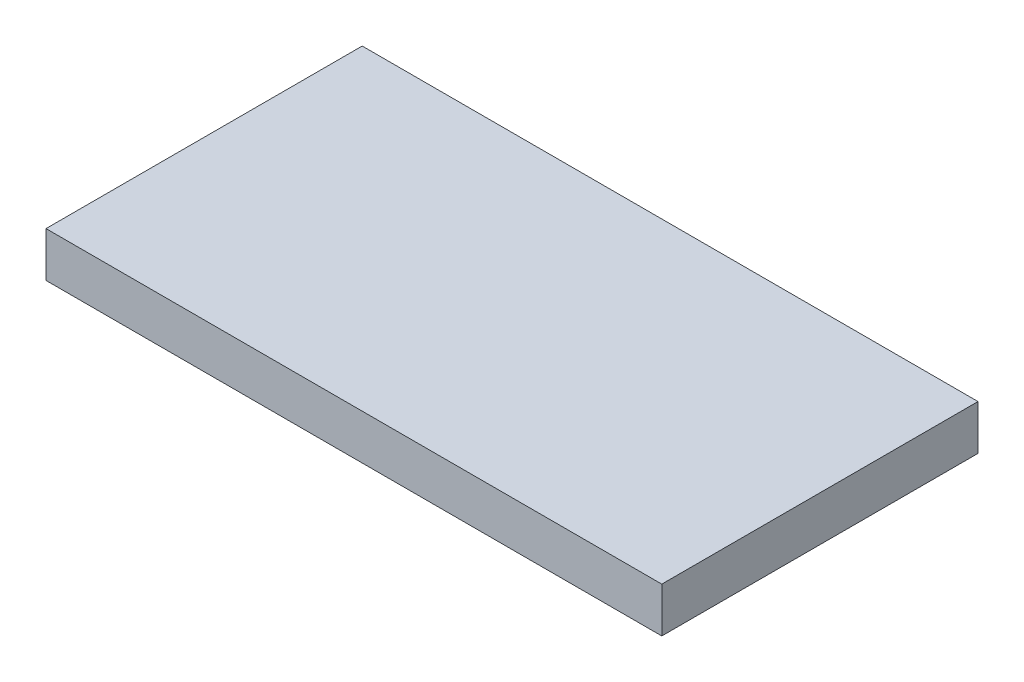
ISO-10303-21;
HEADER;
FILE_DESCRIPTION(('STEP AP214'),'2;1');
FILE_NAME('part.step','',(''),(''),'','','');
FILE_SCHEMA(('AUTOMOTIVE_DESIGN { 1 0 10303 214 1 1 1 1 }'));
ENDSEC;
DATA;
#1=APPLICATION_CONTEXT('core data for automotive mechanical design processes');
#2=APPLICATION_PROTOCOL_DEFINITION('international standard','automotive_design',2000,#1);
#3=PRODUCT_CONTEXT('',#1,'mechanical');
#4=PRODUCT('Part','Part','',(#3));
#5=PRODUCT_RELATED_PRODUCT_CATEGORY('part','',(#4));
#6=PRODUCT_DEFINITION_FORMATION('','',#4);
#7=PRODUCT_DEFINITION_CONTEXT('part definition',#1,'design');
#8=PRODUCT_DEFINITION('design','',#6,#7);
#9=PRODUCT_DEFINITION_SHAPE('','',#8);
#10=(LENGTH_UNIT() NAMED_UNIT(*) SI_UNIT(.MILLI.,.METRE.));
#11=(NAMED_UNIT(*) PLANE_ANGLE_UNIT() SI_UNIT($,.RADIAN.));
#12=(NAMED_UNIT(*) SI_UNIT($,.STERADIAN.) SOLID_ANGLE_UNIT());
#13=UNCERTAINTY_MEASURE_WITH_UNIT(LENGTH_MEASURE(1.E-05),#10,'distance_accuracy_value','');
#14=(GEOMETRIC_REPRESENTATION_CONTEXT(3) GLOBAL_UNCERTAINTY_ASSIGNED_CONTEXT((#13)) GLOBAL_UNIT_ASSIGNED_CONTEXT((#10,
#11,#12)) REPRESENTATION_CONTEXT('',''));
#15=CARTESIAN_POINT('',(0.,0.,0.));
#16=DIRECTION('',(0.,0.,1.));
#17=DIRECTION('',(1.,0.,0.));
#18=AXIS2_PLACEMENT_3D('',#15,#16,#17);
#19=CARTESIAN_POINT('',(0.,27.,0.));
#20=DIRECTION('',(1.,0.,0.));
#21=DIRECTION('',(0.,0.,-1.));
#22=AXIS2_PLACEMENT_3D('',#19,#20,#21);
#23=PLANE('',#22);
#24=DIRECTION('',(0.,0.,1.));
#25=VECTOR('',#24,1.);
#26=CARTESIAN_POINT('',(0.,0.,0.));
#27=LINE('',#26,#25);
#28=CARTESIAN_POINT('',(0.,0.,0.));
#29=VERTEX_POINT('',#28);
#30=CARTESIAN_POINT('',(0.,0.,190.));
#31=VERTEX_POINT('',#30);
#32=EDGE_CURVE('E100',#29,#31,#27,.T.);
#33=ORIENTED_EDGE('',*,*,#32,.T.);
#34=DIRECTION('',(0.,-1.,0.));
#35=VECTOR('',#34,1.);
#36=CARTESIAN_POINT('',(0.,27.,190.));
#37=LINE('',#36,#35);
#38=CARTESIAN_POINT('',(0.,27.,190.));
#39=VERTEX_POINT('',#38);
#40=EDGE_CURVE('E11',#39,#31,#37,.T.);
#41=ORIENTED_EDGE('',*,*,#40,.F.);
#42=DIRECTION('',(0.,0.,1.));
#43=VECTOR('',#42,1.);
#44=CARTESIAN_POINT('',(0.,27.,0.));
#45=LINE('',#44,#43);
#46=CARTESIAN_POINT('',(0.,27.,0.));
#47=VERTEX_POINT('',#46);
#48=EDGE_CURVE('E88',#47,#39,#45,.T.);
#49=ORIENTED_EDGE('',*,*,#48,.F.);
#50=DIRECTION('',(0.,-1.,0.));
#51=VECTOR('',#50,1.);
#52=CARTESIAN_POINT('',(0.,27.,0.));
#53=LINE('',#52,#51);
#54=EDGE_CURVE('E96',#47,#29,#53,.T.);
#55=ORIENTED_EDGE('',*,*,#54,.T.);
#56=EDGE_LOOP('',(#33,#41,#49,#55));
#57=FACE_BOUND('',#56,.T.);
#58=ADVANCED_FACE('F37',(#57),#23,.F.);
#59=CARTESIAN_POINT('',(0.,27.,190.));
#60=DIRECTION('',(0.,0.,-1.));
#61=DIRECTION('',(-1.,0.,0.));
#62=AXIS2_PLACEMENT_3D('',#59,#60,#61);
#63=PLANE('',#62);
#64=DIRECTION('',(1.,0.,0.));
#65=VECTOR('',#64,1.);
#66=CARTESIAN_POINT('',(0.,0.,190.));
#67=LINE('',#66,#65);
#68=CARTESIAN_POINT('',(370.,0.,190.));
#69=VERTEX_POINT('',#68);
#70=EDGE_CURVE('E92',#31,#69,#67,.T.);
#71=ORIENTED_EDGE('',*,*,#70,.T.);
#72=DIRECTION('',(0.,-1.,0.));
#73=VECTOR('',#72,1.);
#74=CARTESIAN_POINT('',(370.,27.,190.));
#75=LINE('',#74,#73);
#76=CARTESIAN_POINT('',(370.,27.,190.));
#77=VERTEX_POINT('',#76);
#78=EDGE_CURVE('E45',#77,#69,#75,.T.);
#79=ORIENTED_EDGE('',*,*,#78,.F.);
#80=DIRECTION('',(1.,0.,0.));
#81=VECTOR('',#80,1.);
#82=CARTESIAN_POINT('',(0.,27.,190.));
#83=LINE('',#82,#81);
#84=EDGE_CURVE('E83',#39,#77,#83,.T.);
#85=ORIENTED_EDGE('',*,*,#84,.F.);
#86=ORIENTED_EDGE('',*,*,#40,.T.);
#87=EDGE_LOOP('',(#71,#79,#85,#86));
#88=FACE_BOUND('',#87,.T.);
#89=ADVANCED_FACE('F91',(#88),#63,.F.);
#90=CARTESIAN_POINT('',(370.,27.,0.));
#91=DIRECTION('',(-1.,0.,0.));
#92=DIRECTION('',(0.,0.,1.));
#93=AXIS2_PLACEMENT_3D('',#90,#91,#92);
#94=PLANE('',#93);
#95=DIRECTION('',(0.,0.,-1.));
#96=VECTOR('',#95,1.);
#97=CARTESIAN_POINT('',(370.,0.,0.));
#98=LINE('',#97,#96);
#99=CARTESIAN_POINT('',(370.,0.,0.));
#100=VERTEX_POINT('',#99);
#101=EDGE_CURVE('E70',#69,#100,#98,.T.);
#102=ORIENTED_EDGE('',*,*,#101,.T.);
#103=DIRECTION('',(0.,-1.,0.));
#104=VECTOR('',#103,1.);
#105=CARTESIAN_POINT('',(370.,27.,0.));
#106=LINE('',#105,#104);
#107=CARTESIAN_POINT('',(370.,27.,0.));
#108=VERTEX_POINT('',#107);
#109=EDGE_CURVE('E93',#108,#100,#106,.T.);
#110=ORIENTED_EDGE('',*,*,#109,.F.);
#111=DIRECTION('',(0.,0.,-1.));
#112=VECTOR('',#111,1.);
#113=CARTESIAN_POINT('',(370.,27.,0.));
#114=LINE('',#113,#112);
#115=EDGE_CURVE('E86',#77,#108,#114,.T.);
#116=ORIENTED_EDGE('',*,*,#115,.F.);
#117=ORIENTED_EDGE('',*,*,#78,.T.);
#118=EDGE_LOOP('',(#102,#110,#116,#117));
#119=FACE_BOUND('',#118,.T.);
#120=ADVANCED_FACE('F94',(#119),#94,.F.);
#121=CARTESIAN_POINT('',(0.,27.,0.));
#122=DIRECTION('',(0.,0.,1.));
#123=DIRECTION('',(1.,0.,0.));
#124=AXIS2_PLACEMENT_3D('',#121,#122,#123);
#125=PLANE('',#124);
#126=DIRECTION('',(-1.,0.,0.));
#127=VECTOR('',#126,1.);
#128=CARTESIAN_POINT('',(0.,0.,0.));
#129=LINE('',#128,#127);
#130=EDGE_CURVE('E76',#100,#29,#129,.T.);
#131=ORIENTED_EDGE('',*,*,#130,.T.);
#132=ORIENTED_EDGE('',*,*,#54,.F.);
#133=DIRECTION('',(-1.,0.,0.));
#134=VECTOR('',#133,1.);
#135=CARTESIAN_POINT('',(0.,27.,0.));
#136=LINE('',#135,#134);
#137=EDGE_CURVE('E53',#108,#47,#136,.T.);
#138=ORIENTED_EDGE('',*,*,#137,.F.);
#139=ORIENTED_EDGE('',*,*,#109,.T.);
#140=EDGE_LOOP('',(#131,#132,#138,#139));
#141=FACE_BOUND('',#140,.T.);
#142=ADVANCED_FACE('F107',(#141),#125,.F.);
#143=CARTESIAN_POINT('',(0.,27.,0.));
#144=DIRECTION('',(0.,1.,0.));
#145=DIRECTION('',(0.,0.,1.));
#146=AXIS2_PLACEMENT_3D('',#143,#144,#145);
#147=PLANE('',#146);
#148=ORIENTED_EDGE('',*,*,#48,.T.);
#149=ORIENTED_EDGE('',*,*,#84,.T.);
#150=ORIENTED_EDGE('',*,*,#115,.T.);
#151=ORIENTED_EDGE('',*,*,#137,.T.);
#152=EDGE_LOOP('',(#148,#149,#150,#151));
#153=FACE_BOUND('',#152,.T.);
#154=ADVANCED_FACE('F84',(#153),#147,.T.);
#155=CARTESIAN_POINT('',(0.,0.,0.));
#156=DIRECTION('',(0.,1.,0.));
#157=DIRECTION('',(0.,0.,1.));
#158=AXIS2_PLACEMENT_3D('',#155,#156,#157);
#159=PLANE('',#158);
#160=ORIENTED_EDGE('',*,*,#32,.F.);
#161=ORIENTED_EDGE('',*,*,#130,.F.);
#162=ORIENTED_EDGE('',*,*,#101,.F.);
#163=ORIENTED_EDGE('',*,*,#70,.F.);
#164=EDGE_LOOP('',(#160,#161,#162,#163));
#165=FACE_BOUND('',#164,.T.);
#166=ADVANCED_FACE('F110',(#165),#159,.F.);
#167=CLOSED_SHELL('',(#58,#89,#120,#142,#154,#166));
#168=MANIFOLD_SOLID_BREP('B2',#167);
#169=ADVANCED_BREP_SHAPE_REPRESENTATION('',(#18,#168),#14);
#170=SHAPE_DEFINITION_REPRESENTATION(#9,#169);
ENDSEC;
END-ISO-10303-21;
